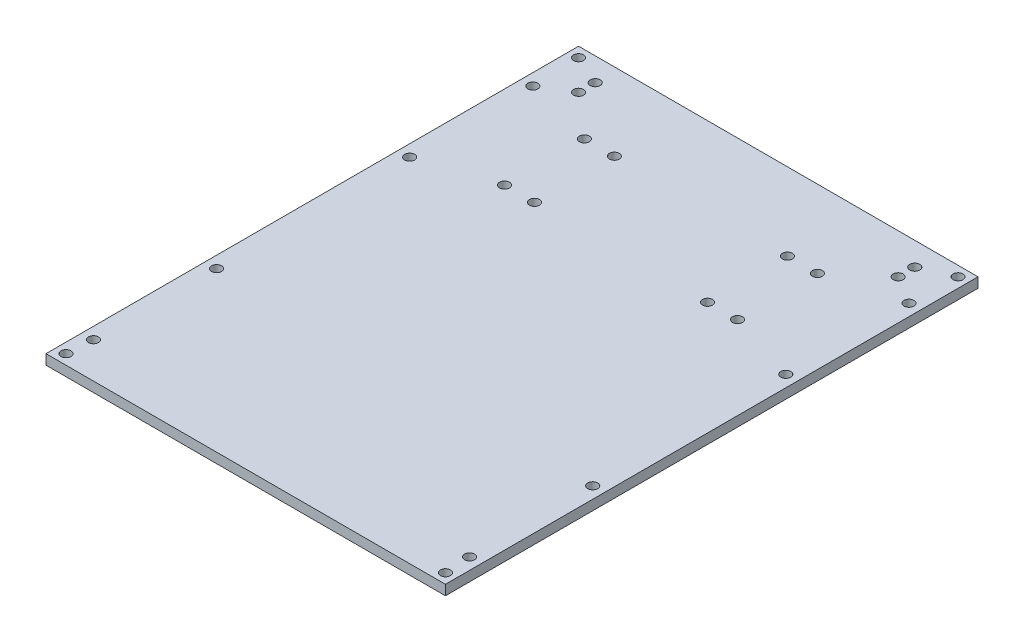
ISO-10303-21;
HEADER;
FILE_DESCRIPTION(('STEP AP214'),'2;1');
FILE_NAME('part.step','',(''),(''),'','','');
FILE_SCHEMA(('AUTOMOTIVE_DESIGN { 1 0 10303 214 1 1 1 1 }'));
ENDSEC;
DATA;
#1=APPLICATION_CONTEXT('core data for automotive mechanical design processes');
#2=APPLICATION_PROTOCOL_DEFINITION('international standard','automotive_design',2000,#1);
#3=PRODUCT_CONTEXT('',#1,'mechanical');
#4=PRODUCT('Part','Part','',(#3));
#5=PRODUCT_RELATED_PRODUCT_CATEGORY('part','',(#4));
#6=PRODUCT_DEFINITION_FORMATION('','',#4);
#7=PRODUCT_DEFINITION_CONTEXT('part definition',#1,'design');
#8=PRODUCT_DEFINITION('design','',#6,#7);
#9=PRODUCT_DEFINITION_SHAPE('','',#8);
#10=(LENGTH_UNIT() NAMED_UNIT(*) SI_UNIT(.MILLI.,.METRE.));
#11=(NAMED_UNIT(*) PLANE_ANGLE_UNIT() SI_UNIT($,.RADIAN.));
#12=(NAMED_UNIT(*) SI_UNIT($,.STERADIAN.) SOLID_ANGLE_UNIT());
#13=UNCERTAINTY_MEASURE_WITH_UNIT(LENGTH_MEASURE(1.E-05),#10,'distance_accuracy_value','');
#14=(GEOMETRIC_REPRESENTATION_CONTEXT(3) GLOBAL_UNCERTAINTY_ASSIGNED_CONTEXT((#13)) GLOBAL_UNIT_ASSIGNED_CONTEXT((#10,
#11,#12)) REPRESENTATION_CONTEXT('',''));
#15=CARTESIAN_POINT('',(0.,0.,0.));
#16=DIRECTION('',(0.,0.,1.));
#17=DIRECTION('',(1.,0.,0.));
#18=AXIS2_PLACEMENT_3D('',#15,#16,#17);
#19=CARTESIAN_POINT('',(0.,3.,0.));
#20=DIRECTION('',(0.,1.,0.));
#21=DIRECTION('',(0.,0.,1.));
#22=AXIS2_PLACEMENT_3D('',#19,#20,#21);
#23=PLANE('',#22);
#24=CARTESIAN_POINT('',(-3.,3.,-157.));
#25=DIRECTION('',(0.,1.,0.));
#26=DIRECTION('',(0.,0.,1.));
#27=AXIS2_PLACEMENT_3D('',#24,#25,#26);
#28=CIRCLE('',#27,1.5);
#29=CARTESIAN_POINT('',(-3.,3.,-155.5));
#30=VERTEX_POINT('',#29);
#31=EDGE_CURVE('E480',#30,#30,#28,.T.);
#32=ORIENTED_EDGE('',*,*,#31,.F.);
#33=EDGE_LOOP('',(#32));
#34=FACE_BOUND('',#33,.T.);
#35=CARTESIAN_POINT('',(-117.,3.,-3.));
#36=DIRECTION('',(0.,1.,0.));
#37=DIRECTION('',(0.,0.,1.));
#38=AXIS2_PLACEMENT_3D('',#35,#36,#37);
#39=CIRCLE('',#38,1.5);
#40=CARTESIAN_POINT('',(-117.,3.,-1.5));
#41=VERTEX_POINT('',#40);
#42=EDGE_CURVE('E481',#41,#41,#39,.T.);
#43=ORIENTED_EDGE('',*,*,#42,.F.);
#44=EDGE_LOOP('',(#43));
#45=FACE_BOUND('',#44,.T.);
#46=CARTESIAN_POINT('',(-3.,3.,-3.));
#47=DIRECTION('',(0.,1.,0.));
#48=DIRECTION('',(0.,0.,1.));
#49=AXIS2_PLACEMENT_3D('',#46,#47,#48);
#50=CIRCLE('',#49,1.5);
#51=CARTESIAN_POINT('',(-3.,3.,-1.5));
#52=VERTEX_POINT('',#51);
#53=EDGE_CURVE('E485',#52,#52,#50,.T.);
#54=ORIENTED_EDGE('',*,*,#53,.F.);
#55=EDGE_LOOP('',(#54));
#56=FACE_BOUND('',#55,.T.);
#57=CARTESIAN_POINT('',(-117.,3.,-157.));
#58=DIRECTION('',(0.,1.,0.));
#59=DIRECTION('',(0.,0.,1.));
#60=AXIS2_PLACEMENT_3D('',#57,#58,#59);
#61=CIRCLE('',#60,1.5);
#62=CARTESIAN_POINT('',(-117.,3.,-155.5));
#63=VERTEX_POINT('',#62);
#64=EDGE_CURVE('E114',#63,#63,#61,.T.);
#65=ORIENTED_EDGE('',*,*,#64,.F.);
#66=EDGE_LOOP('',(#65));
#67=FACE_BOUND('',#66,.T.);
#68=CARTESIAN_POINT('',(-3.5,3.,-47.75));
#69=DIRECTION('',(0.,1.,0.));
#70=DIRECTION('',(0.,0.,1.));
#71=AXIS2_PLACEMENT_3D('',#68,#69,#70);
#72=CIRCLE('',#71,1.5);
#73=CARTESIAN_POINT('',(-3.5,3.,-46.25));
#74=VERTEX_POINT('',#73);
#75=EDGE_CURVE('E189',#74,#74,#72,.T.);
#76=ORIENTED_EDGE('',*,*,#75,.F.);
#77=EDGE_LOOP('',(#76));
#78=FACE_BOUND('',#77,.T.);
#79=CARTESIAN_POINT('',(-95.,3.,-112.75));
#80=DIRECTION('',(0.,-1.,0.));
#81=DIRECTION('',(0.,0.,-1.));
#82=AXIS2_PLACEMENT_3D('',#79,#80,#81);
#83=CIRCLE('',#82,1.5);
#84=CARTESIAN_POINT('',(-95.,3.,-114.25));
#85=VERTEX_POINT('',#84);
#86=EDGE_CURVE('E177',#85,#85,#83,.T.);
#87=ORIENTED_EDGE('',*,*,#86,.T.);
#88=EDGE_LOOP('',(#87));
#89=FACE_BOUND('',#88,.T.);
#90=CARTESIAN_POINT('',(-86.,3.,-136.75));
#91=DIRECTION('',(0.,-1.,0.));
#92=DIRECTION('',(0.,0.,-1.));
#93=AXIS2_PLACEMENT_3D('',#90,#91,#92);
#94=CIRCLE('',#93,1.5);
#95=CARTESIAN_POINT('',(-86.,3.,-138.25));
#96=VERTEX_POINT('',#95);
#97=EDGE_CURVE('E165',#96,#96,#94,.T.);
#98=ORIENTED_EDGE('',*,*,#97,.T.);
#99=EDGE_LOOP('',(#98));
#100=FACE_BOUND('',#99,.T.);
#101=CARTESIAN_POINT('',(-116.5,3.,-142.75));
#102=DIRECTION('',(0.,-1.,0.));
#103=DIRECTION('',(0.,0.,-1.));
#104=AXIS2_PLACEMENT_3D('',#101,#102,#103);
#105=CIRCLE('',#104,1.50000000000002);
#106=CARTESIAN_POINT('',(-116.5,3.,-144.25));
#107=VERTEX_POINT('',#106);
#108=EDGE_CURVE('E153',#107,#107,#105,.T.);
#109=ORIENTED_EDGE('',*,*,#108,.T.);
#110=EDGE_LOOP('',(#109));
#111=FACE_BOUND('',#110,.T.);
#112=CARTESIAN_POINT('',(-108.,3.,-153.));
#113=DIRECTION('',(0.,-1.,0.));
#114=DIRECTION('',(0.,0.,-1.));
#115=AXIS2_PLACEMENT_3D('',#112,#113,#114);
#116=CIRCLE('',#115,1.50000000000002);
#117=CARTESIAN_POINT('',(-108.,3.,-154.5));
#118=VERTEX_POINT('',#117);
#119=EDGE_CURVE('E237',#118,#118,#116,.T.);
#120=ORIENTED_EDGE('',*,*,#119,.T.);
#121=EDGE_LOOP('',(#120));
#122=FACE_BOUND('',#121,.T.);
#123=CARTESIAN_POINT('',(-12.,3.,-153.));
#124=DIRECTION('',(0.,1.,0.));
#125=DIRECTION('',(0.,0.,1.));
#126=AXIS2_PLACEMENT_3D('',#123,#124,#125);
#127=CIRCLE('',#126,1.5);
#128=CARTESIAN_POINT('',(-12.,3.,-151.5));
#129=VERTEX_POINT('',#128);
#130=EDGE_CURVE('E231',#129,#129,#127,.T.);
#131=ORIENTED_EDGE('',*,*,#130,.F.);
#132=EDGE_LOOP('',(#131));
#133=FACE_BOUND('',#132,.T.);
#134=CARTESIAN_POINT('',(-12.,3.,-148.));
#135=DIRECTION('',(0.,1.,0.));
#136=DIRECTION('',(0.,0.,1.));
#137=AXIS2_PLACEMENT_3D('',#134,#135,#136);
#138=CIRCLE('',#137,1.5);
#139=CARTESIAN_POINT('',(-12.,3.,-146.5));
#140=VERTEX_POINT('',#139);
#141=EDGE_CURVE('E225',#140,#140,#138,.T.);
#142=ORIENTED_EDGE('',*,*,#141,.F.);
#143=EDGE_LOOP('',(#142));
#144=FACE_BOUND('',#143,.T.);
#145=CARTESIAN_POINT('',(-3.49999999999999,3.,-142.75));
#146=DIRECTION('',(0.,1.,0.));
#147=DIRECTION('',(0.,0.,1.));
#148=AXIS2_PLACEMENT_3D('',#145,#146,#147);
#149=CIRCLE('',#148,1.5);
#150=CARTESIAN_POINT('',(-3.49999999999999,3.,-141.25));
#151=VERTEX_POINT('',#150);
#152=EDGE_CURVE('E207',#151,#151,#149,.T.);
#153=ORIENTED_EDGE('',*,*,#152,.F.);
#154=EDGE_LOOP('',(#153));
#155=FACE_BOUND('',#154,.T.);
#156=CARTESIAN_POINT('',(-3.49999999999999,3.,-105.75));
#157=DIRECTION('',(0.,1.,0.));
#158=DIRECTION('',(0.,0.,1.));
#159=AXIS2_PLACEMENT_3D('',#156,#157,#158);
#160=CIRCLE('',#159,1.5);
#161=CARTESIAN_POINT('',(-3.49999999999999,3.,-104.25));
#162=VERTEX_POINT('',#161);
#163=EDGE_CURVE('E208',#162,#162,#160,.T.);
#164=ORIENTED_EDGE('',*,*,#163,.F.);
#165=EDGE_LOOP('',(#164));
#166=FACE_BOUND('',#165,.T.);
#167=CARTESIAN_POINT('',(-34.,3.,-136.75));
#168=DIRECTION('',(0.,1.,0.));
#169=DIRECTION('',(0.,0.,1.));
#170=AXIS2_PLACEMENT_3D('',#167,#168,#169);
#171=CIRCLE('',#170,1.5);
#172=CARTESIAN_POINT('',(-34.,3.,-135.25));
#173=VERTEX_POINT('',#172);
#174=EDGE_CURVE('E215',#173,#173,#171,.T.);
#175=ORIENTED_EDGE('',*,*,#174,.F.);
#176=EDGE_LOOP('',(#175));
#177=FACE_BOUND('',#176,.T.);
#178=CARTESIAN_POINT('',(-25.,3.,-136.75));
#179=DIRECTION('',(0.,1.,0.));
#180=DIRECTION('',(0.,0.,1.));
#181=AXIS2_PLACEMENT_3D('',#178,#179,#180);
#182=CIRCLE('',#181,1.5);
#183=CARTESIAN_POINT('',(-25.,3.,-135.25));
#184=VERTEX_POINT('',#183);
#185=EDGE_CURVE('E194',#184,#184,#182,.T.);
#186=ORIENTED_EDGE('',*,*,#185,.F.);
#187=EDGE_LOOP('',(#186));
#188=FACE_BOUND('',#187,.T.);
#189=CARTESIAN_POINT('',(-34.,3.,-112.75));
#190=DIRECTION('',(0.,1.,0.));
#191=DIRECTION('',(0.,0.,1.));
#192=AXIS2_PLACEMENT_3D('',#189,#190,#191);
#193=CIRCLE('',#192,1.5);
#194=CARTESIAN_POINT('',(-34.,3.,-111.25));
#195=VERTEX_POINT('',#194);
#196=EDGE_CURVE('E201',#195,#195,#193,.T.);
#197=ORIENTED_EDGE('',*,*,#196,.F.);
#198=EDGE_LOOP('',(#197));
#199=FACE_BOUND('',#198,.T.);
#200=CARTESIAN_POINT('',(-116.5,3.,-47.75));
#201=DIRECTION('',(0.,-1.,0.));
#202=DIRECTION('',(0.,0.,-1.));
#203=AXIS2_PLACEMENT_3D('',#200,#201,#202);
#204=CIRCLE('',#203,1.5);
#205=CARTESIAN_POINT('',(-116.5,3.,-49.25));
#206=VERTEX_POINT('',#205);
#207=EDGE_CURVE('E141',#206,#206,#204,.T.);
#208=ORIENTED_EDGE('',*,*,#207,.T.);
#209=EDGE_LOOP('',(#208));
#210=FACE_BOUND('',#209,.T.);
#211=CARTESIAN_POINT('',(-3.5,3.,-10.75));
#212=DIRECTION('',(0.,1.,0.));
#213=DIRECTION('',(0.,0.,1.));
#214=AXIS2_PLACEMENT_3D('',#211,#212,#213);
#215=CIRCLE('',#214,1.5);
#216=CARTESIAN_POINT('',(-3.5,3.,-9.25000000000001));
#217=VERTEX_POINT('',#216);
#218=EDGE_CURVE('E134',#217,#217,#215,.T.);
#219=ORIENTED_EDGE('',*,*,#218,.F.);
#220=EDGE_LOOP('',(#219));
#221=FACE_BOUND('',#220,.T.);
#222=CARTESIAN_POINT('',(-25.,3.,-112.75));
#223=DIRECTION('',(0.,1.,0.));
#224=DIRECTION('',(0.,0.,1.));
#225=AXIS2_PLACEMENT_3D('',#222,#223,#224);
#226=CIRCLE('',#225,1.5);
#227=CARTESIAN_POINT('',(-25.,3.,-111.25));
#228=VERTEX_POINT('',#227);
#229=EDGE_CURVE('E211',#228,#228,#226,.T.);
#230=ORIENTED_EDGE('',*,*,#229,.F.);
#231=EDGE_LOOP('',(#230));
#232=FACE_BOUND('',#231,.T.);
#233=DIRECTION('',(0.,0.,1.));
#234=VECTOR('',#233,1.);
#235=CARTESIAN_POINT('',(-120.,3.,-160.));
#236=LINE('',#235,#234);
#237=CARTESIAN_POINT('',(-120.,3.,-160.));
#238=VERTEX_POINT('',#237);
#239=CARTESIAN_POINT('',(-120.,3.,0.));
#240=VERTEX_POINT('',#239);
#241=EDGE_CURVE('E88',#238,#240,#236,.T.);
#242=ORIENTED_EDGE('',*,*,#241,.T.);
#243=DIRECTION('',(1.,0.,0.));
#244=VECTOR('',#243,1.);
#245=CARTESIAN_POINT('',(-120.,3.,0.));
#246=LINE('',#245,#244);
#247=CARTESIAN_POINT('',(0.,3.,0.));
#248=VERTEX_POINT('',#247);
#249=EDGE_CURVE('E83',#240,#248,#246,.T.);
#250=ORIENTED_EDGE('',*,*,#249,.T.);
#251=DIRECTION('',(0.,0.,-1.));
#252=VECTOR('',#251,1.);
#253=CARTESIAN_POINT('',(0.,3.,-160.));
#254=LINE('',#253,#252);
#255=CARTESIAN_POINT('',(0.,3.,-160.));
#256=VERTEX_POINT('',#255);
#257=EDGE_CURVE('E86',#248,#256,#254,.T.);
#258=ORIENTED_EDGE('',*,*,#257,.T.);
#259=DIRECTION('',(-1.,0.,0.));
#260=VECTOR('',#259,1.);
#261=CARTESIAN_POINT('',(-120.,3.,-160.));
#262=LINE('',#261,#260);
#263=EDGE_CURVE('E53',#256,#238,#262,.T.);
#264=ORIENTED_EDGE('',*,*,#263,.T.);
#265=EDGE_LOOP('',(#242,#250,#258,#264));
#266=FACE_BOUND('',#265,.T.);
#267=CARTESIAN_POINT('',(-116.5,3.,-10.75));
#268=DIRECTION('',(0.,-1.,0.));
#269=DIRECTION('',(0.,0.,-1.));
#270=AXIS2_PLACEMENT_3D('',#267,#268,#269);
#271=CIRCLE('',#270,1.5);
#272=CARTESIAN_POINT('',(-116.5,3.,-12.25));
#273=VERTEX_POINT('',#272);
#274=EDGE_CURVE('E125',#273,#273,#271,.T.);
#275=ORIENTED_EDGE('',*,*,#274,.T.);
#276=EDGE_LOOP('',(#275));
#277=FACE_BOUND('',#276,.T.);
#278=CARTESIAN_POINT('',(-108.,3.,-148.));
#279=DIRECTION('',(0.,-1.,0.));
#280=DIRECTION('',(0.,0.,-1.));
#281=AXIS2_PLACEMENT_3D('',#278,#279,#280);
#282=CIRCLE('',#281,1.5);
#283=CARTESIAN_POINT('',(-108.,3.,-149.5));
#284=VERTEX_POINT('',#283);
#285=EDGE_CURVE('E146',#284,#284,#282,.T.);
#286=ORIENTED_EDGE('',*,*,#285,.T.);
#287=EDGE_LOOP('',(#286));
#288=FACE_BOUND('',#287,.T.);
#289=CARTESIAN_POINT('',(-95.,3.,-136.75));
#290=DIRECTION('',(0.,-1.,0.));
#291=DIRECTION('',(0.,0.,-1.));
#292=AXIS2_PLACEMENT_3D('',#289,#290,#291);
#293=CIRCLE('',#292,1.5);
#294=CARTESIAN_POINT('',(-95.,3.,-138.25));
#295=VERTEX_POINT('',#294);
#296=EDGE_CURVE('E159',#295,#295,#293,.T.);
#297=ORIENTED_EDGE('',*,*,#296,.T.);
#298=EDGE_LOOP('',(#297));
#299=FACE_BOUND('',#298,.T.);
#300=CARTESIAN_POINT('',(-86.,3.,-112.75));
#301=DIRECTION('',(0.,-1.,0.));
#302=DIRECTION('',(0.,0.,-1.));
#303=AXIS2_PLACEMENT_3D('',#300,#301,#302);
#304=CIRCLE('',#303,1.5);
#305=CARTESIAN_POINT('',(-86.,3.,-114.25));
#306=VERTEX_POINT('',#305);
#307=EDGE_CURVE('E171',#306,#306,#304,.T.);
#308=ORIENTED_EDGE('',*,*,#307,.T.);
#309=EDGE_LOOP('',(#308));
#310=FACE_BOUND('',#309,.T.);
#311=CARTESIAN_POINT('',(-116.5,3.,-105.75));
#312=DIRECTION('',(0.,-1.,0.));
#313=DIRECTION('',(0.,0.,-1.));
#314=AXIS2_PLACEMENT_3D('',#311,#312,#313);
#315=CIRCLE('',#314,1.50000000000002);
#316=CARTESIAN_POINT('',(-116.5,3.,-107.25));
#317=VERTEX_POINT('',#316);
#318=EDGE_CURVE('E183',#317,#317,#315,.T.);
#319=ORIENTED_EDGE('',*,*,#318,.T.);
#320=EDGE_LOOP('',(#319));
#321=FACE_BOUND('',#320,.T.);
#322=ADVANCED_FACE('F34',(#34,#45,#56,#67,#78,#89,#100,#111,#122,#133,#144,#155,#166,#177,#188,
#199,#210,#221,#232,#266,#277,#288,#299,#310,#321),#23,.T.);
#323=CARTESIAN_POINT('',(0.,0.,0.));
#324=DIRECTION('',(0.,1.,0.));
#325=DIRECTION('',(0.,0.,1.));
#326=AXIS2_PLACEMENT_3D('',#323,#324,#325);
#327=PLANE('',#326);
#328=CARTESIAN_POINT('',(-3.,0.,-157.));
#329=DIRECTION('',(0.,1.,0.));
#330=DIRECTION('',(0.,0.,1.));
#331=AXIS2_PLACEMENT_3D('',#328,#329,#330);
#332=CIRCLE('',#331,1.5);
#333=CARTESIAN_POINT('',(-3.,0.,-155.5));
#334=VERTEX_POINT('',#333);
#335=EDGE_CURVE('E38',#334,#334,#332,.T.);
#336=ORIENTED_EDGE('',*,*,#335,.T.);
#337=EDGE_LOOP('',(#336));
#338=FACE_BOUND('',#337,.T.);
#339=CARTESIAN_POINT('',(-117.,0.,-3.));
#340=DIRECTION('',(0.,1.,0.));
#341=DIRECTION('',(0.,0.,1.));
#342=AXIS2_PLACEMENT_3D('',#339,#340,#341);
#343=CIRCLE('',#342,1.5);
#344=CARTESIAN_POINT('',(-117.,0.,-1.5));
#345=VERTEX_POINT('',#344);
#346=EDGE_CURVE('E116',#345,#345,#343,.T.);
#347=ORIENTED_EDGE('',*,*,#346,.T.);
#348=EDGE_LOOP('',(#347));
#349=FACE_BOUND('',#348,.T.);
#350=CARTESIAN_POINT('',(-3.,0.,-3.));
#351=DIRECTION('',(0.,1.,0.));
#352=DIRECTION('',(0.,0.,1.));
#353=AXIS2_PLACEMENT_3D('',#350,#351,#352);
#354=CIRCLE('',#353,1.5);
#355=CARTESIAN_POINT('',(-3.,0.,-1.5));
#356=VERTEX_POINT('',#355);
#357=EDGE_CURVE('E113',#356,#356,#354,.T.);
#358=ORIENTED_EDGE('',*,*,#357,.T.);
#359=EDGE_LOOP('',(#358));
#360=FACE_BOUND('',#359,.T.);
#361=CARTESIAN_POINT('',(-117.,0.,-157.));
#362=DIRECTION('',(0.,1.,0.));
#363=DIRECTION('',(0.,0.,1.));
#364=AXIS2_PLACEMENT_3D('',#361,#362,#363);
#365=CIRCLE('',#364,1.5);
#366=CARTESIAN_POINT('',(-117.,0.,-155.5));
#367=VERTEX_POINT('',#366);
#368=EDGE_CURVE('E110',#367,#367,#365,.T.);
#369=ORIENTED_EDGE('',*,*,#368,.T.);
#370=EDGE_LOOP('',(#369));
#371=FACE_BOUND('',#370,.T.);
#372=CARTESIAN_POINT('',(-3.5,0.,-47.75));
#373=DIRECTION('',(0.,1.,0.));
#374=DIRECTION('',(0.,0.,1.));
#375=AXIS2_PLACEMENT_3D('',#372,#373,#374);
#376=CIRCLE('',#375,1.5);
#377=CARTESIAN_POINT('',(-3.5,0.,-46.25));
#378=VERTEX_POINT('',#377);
#379=EDGE_CURVE('E137',#378,#378,#376,.T.);
#380=ORIENTED_EDGE('',*,*,#379,.T.);
#381=EDGE_LOOP('',(#380));
#382=FACE_BOUND('',#381,.T.);
#383=CARTESIAN_POINT('',(-12.,0.,-153.));
#384=DIRECTION('',(0.,1.,0.));
#385=DIRECTION('',(0.,0.,1.));
#386=AXIS2_PLACEMENT_3D('',#383,#384,#385);
#387=CIRCLE('',#386,1.5);
#388=CARTESIAN_POINT('',(-12.,0.,-151.5));
#389=VERTEX_POINT('',#388);
#390=EDGE_CURVE('E234',#389,#389,#387,.T.);
#391=ORIENTED_EDGE('',*,*,#390,.T.);
#392=EDGE_LOOP('',(#391));
#393=FACE_BOUND('',#392,.T.);
#394=CARTESIAN_POINT('',(-12.,0.,-148.));
#395=DIRECTION('',(0.,1.,0.));
#396=DIRECTION('',(0.,0.,1.));
#397=AXIS2_PLACEMENT_3D('',#394,#395,#396);
#398=CIRCLE('',#397,1.5);
#399=CARTESIAN_POINT('',(-12.,0.,-146.5));
#400=VERTEX_POINT('',#399);
#401=EDGE_CURVE('E228',#400,#400,#398,.T.);
#402=ORIENTED_EDGE('',*,*,#401,.T.);
#403=EDGE_LOOP('',(#402));
#404=FACE_BOUND('',#403,.T.);
#405=CARTESIAN_POINT('',(-3.49999999999999,0.,-142.75));
#406=DIRECTION('',(0.,1.,0.));
#407=DIRECTION('',(0.,0.,1.));
#408=AXIS2_PLACEMENT_3D('',#405,#406,#407);
#409=CIRCLE('',#408,1.5);
#410=CARTESIAN_POINT('',(-3.49999999999999,0.,-141.25));
#411=VERTEX_POINT('',#410);
#412=EDGE_CURVE('E222',#411,#411,#409,.T.);
#413=ORIENTED_EDGE('',*,*,#412,.T.);
#414=EDGE_LOOP('',(#413));
#415=FACE_BOUND('',#414,.T.);
#416=CARTESIAN_POINT('',(-3.49999999999999,0.,-105.75));
#417=DIRECTION('',(0.,1.,0.));
#418=DIRECTION('',(0.,0.,1.));
#419=AXIS2_PLACEMENT_3D('',#416,#417,#418);
#420=CIRCLE('',#419,1.5);
#421=CARTESIAN_POINT('',(-3.49999999999999,0.,-104.25));
#422=VERTEX_POINT('',#421);
#423=EDGE_CURVE('E212',#422,#422,#420,.T.);
#424=ORIENTED_EDGE('',*,*,#423,.T.);
#425=EDGE_LOOP('',(#424));
#426=FACE_BOUND('',#425,.T.);
#427=CARTESIAN_POINT('',(-34.,0.,-136.75));
#428=DIRECTION('',(0.,1.,0.));
#429=DIRECTION('',(0.,0.,1.));
#430=AXIS2_PLACEMENT_3D('',#427,#428,#429);
#431=CIRCLE('',#430,1.5);
#432=CARTESIAN_POINT('',(-34.,0.,-135.25));
#433=VERTEX_POINT('',#432);
#434=EDGE_CURVE('E197',#433,#433,#431,.T.);
#435=ORIENTED_EDGE('',*,*,#434,.T.);
#436=EDGE_LOOP('',(#435));
#437=FACE_BOUND('',#436,.T.);
#438=CARTESIAN_POINT('',(-25.,0.,-136.75));
#439=DIRECTION('',(0.,1.,0.));
#440=DIRECTION('',(0.,0.,1.));
#441=AXIS2_PLACEMENT_3D('',#438,#439,#440);
#442=CIRCLE('',#441,1.5);
#443=CARTESIAN_POINT('',(-25.,0.,-135.25));
#444=VERTEX_POINT('',#443);
#445=EDGE_CURVE('E198',#444,#444,#442,.T.);
#446=ORIENTED_EDGE('',*,*,#445,.T.);
#447=EDGE_LOOP('',(#446));
#448=FACE_BOUND('',#447,.T.);
#449=CARTESIAN_POINT('',(-34.,0.,-112.75));
#450=DIRECTION('',(0.,1.,0.));
#451=DIRECTION('',(0.,0.,1.));
#452=AXIS2_PLACEMENT_3D('',#449,#450,#451);
#453=CIRCLE('',#452,1.5);
#454=CARTESIAN_POINT('',(-34.,0.,-111.25));
#455=VERTEX_POINT('',#454);
#456=EDGE_CURVE('E204',#455,#455,#453,.T.);
#457=ORIENTED_EDGE('',*,*,#456,.T.);
#458=EDGE_LOOP('',(#457));
#459=FACE_BOUND('',#458,.T.);
#460=CARTESIAN_POINT('',(-3.5,0.,-10.75));
#461=DIRECTION('',(0.,1.,0.));
#462=DIRECTION('',(0.,0.,1.));
#463=AXIS2_PLACEMENT_3D('',#460,#461,#462);
#464=CIRCLE('',#463,1.5);
#465=CARTESIAN_POINT('',(-3.5,0.,-9.25000000000001));
#466=VERTEX_POINT('',#465);
#467=EDGE_CURVE('E138',#466,#466,#464,.T.);
#468=ORIENTED_EDGE('',*,*,#467,.T.);
#469=EDGE_LOOP('',(#468));
#470=FACE_BOUND('',#469,.T.);
#471=CARTESIAN_POINT('',(-25.,0.,-112.75));
#472=DIRECTION('',(0.,1.,0.));
#473=DIRECTION('',(0.,0.,1.));
#474=AXIS2_PLACEMENT_3D('',#471,#472,#473);
#475=CIRCLE('',#474,1.5);
#476=CARTESIAN_POINT('',(-25.,0.,-111.25));
#477=VERTEX_POINT('',#476);
#478=EDGE_CURVE('E104',#477,#477,#475,.T.);
#479=ORIENTED_EDGE('',*,*,#478,.T.);
#480=EDGE_LOOP('',(#479));
#481=FACE_BOUND('',#480,.T.);
#482=DIRECTION('',(0.,0.,1.));
#483=VECTOR('',#482,1.);
#484=CARTESIAN_POINT('',(-120.,0.,-160.));
#485=LINE('',#484,#483);
#486=CARTESIAN_POINT('',(-120.,0.,-160.));
#487=VERTEX_POINT('',#486);
#488=CARTESIAN_POINT('',(-120.,0.,0.));
#489=VERTEX_POINT('',#488);
#490=EDGE_CURVE('E101',#487,#489,#485,.T.);
#491=ORIENTED_EDGE('',*,*,#490,.F.);
#492=DIRECTION('',(-1.,0.,0.));
#493=VECTOR('',#492,1.);
#494=CARTESIAN_POINT('',(-120.,0.,-160.));
#495=LINE('',#494,#493);
#496=CARTESIAN_POINT('',(0.,0.,-160.));
#497=VERTEX_POINT('',#496);
#498=EDGE_CURVE('E76',#497,#487,#495,.T.);
#499=ORIENTED_EDGE('',*,*,#498,.F.);
#500=DIRECTION('',(0.,0.,-1.));
#501=VECTOR('',#500,1.);
#502=CARTESIAN_POINT('',(0.,0.,-160.));
#503=LINE('',#502,#501);
#504=CARTESIAN_POINT('',(0.,0.,0.));
#505=VERTEX_POINT('',#504);
#506=EDGE_CURVE('E70',#505,#497,#503,.T.);
#507=ORIENTED_EDGE('',*,*,#506,.F.);
#508=DIRECTION('',(1.,0.,0.));
#509=VECTOR('',#508,1.);
#510=CARTESIAN_POINT('',(-120.,0.,0.));
#511=LINE('',#510,#509);
#512=EDGE_CURVE('E92',#489,#505,#511,.T.);
#513=ORIENTED_EDGE('',*,*,#512,.F.);
#514=EDGE_LOOP('',(#491,#499,#507,#513));
#515=FACE_BOUND('',#514,.T.);
#516=CARTESIAN_POINT('',(-116.5,0.,-47.75));
#517=DIRECTION('',(0.,-1.,0.));
#518=DIRECTION('',(0.,0.,-1.));
#519=AXIS2_PLACEMENT_3D('',#516,#517,#518);
#520=CIRCLE('',#519,1.5);
#521=CARTESIAN_POINT('',(-116.5,0.,-49.25));
#522=VERTEX_POINT('',#521);
#523=EDGE_CURVE('E130',#522,#522,#520,.T.);
#524=ORIENTED_EDGE('',*,*,#523,.F.);
#525=EDGE_LOOP('',(#524));
#526=FACE_BOUND('',#525,.T.);
#527=CARTESIAN_POINT('',(-116.5,0.,-10.75));
#528=DIRECTION('',(0.,-1.,0.));
#529=DIRECTION('',(0.,0.,-1.));
#530=AXIS2_PLACEMENT_3D('',#527,#528,#529);
#531=CIRCLE('',#530,1.5);
#532=CARTESIAN_POINT('',(-116.5,0.,-12.25));
#533=VERTEX_POINT('',#532);
#534=EDGE_CURVE('E121',#533,#533,#531,.T.);
#535=ORIENTED_EDGE('',*,*,#534,.F.);
#536=EDGE_LOOP('',(#535));
#537=FACE_BOUND('',#536,.T.);
#538=CARTESIAN_POINT('',(-108.,0.,-153.));
#539=DIRECTION('',(0.,-1.,0.));
#540=DIRECTION('',(0.,0.,-1.));
#541=AXIS2_PLACEMENT_3D('',#538,#539,#540);
#542=CIRCLE('',#541,1.50000000000002);
#543=CARTESIAN_POINT('',(-108.,0.,-154.5));
#544=VERTEX_POINT('',#543);
#545=EDGE_CURVE('E149',#544,#544,#542,.T.);
#546=ORIENTED_EDGE('',*,*,#545,.F.);
#547=EDGE_LOOP('',(#546));
#548=FACE_BOUND('',#547,.T.);
#549=CARTESIAN_POINT('',(-108.,0.,-148.));
#550=DIRECTION('',(0.,-1.,0.));
#551=DIRECTION('',(0.,0.,-1.));
#552=AXIS2_PLACEMENT_3D('',#549,#550,#551);
#553=CIRCLE('',#552,1.5);
#554=CARTESIAN_POINT('',(-108.,0.,-149.5));
#555=VERTEX_POINT('',#554);
#556=EDGE_CURVE('E150',#555,#555,#553,.T.);
#557=ORIENTED_EDGE('',*,*,#556,.F.);
#558=EDGE_LOOP('',(#557));
#559=FACE_BOUND('',#558,.T.);
#560=CARTESIAN_POINT('',(-116.5,0.,-142.75));
#561=DIRECTION('',(0.,-1.,0.));
#562=DIRECTION('',(0.,0.,-1.));
#563=AXIS2_PLACEMENT_3D('',#560,#561,#562);
#564=CIRCLE('',#563,1.50000000000002);
#565=CARTESIAN_POINT('',(-116.5,0.,-144.25));
#566=VERTEX_POINT('',#565);
#567=EDGE_CURVE('E156',#566,#566,#564,.T.);
#568=ORIENTED_EDGE('',*,*,#567,.F.);
#569=EDGE_LOOP('',(#568));
#570=FACE_BOUND('',#569,.T.);
#571=CARTESIAN_POINT('',(-95.,0.,-136.75));
#572=DIRECTION('',(0.,-1.,0.));
#573=DIRECTION('',(0.,0.,-1.));
#574=AXIS2_PLACEMENT_3D('',#571,#572,#573);
#575=CIRCLE('',#574,1.5);
#576=CARTESIAN_POINT('',(-95.,0.,-138.25));
#577=VERTEX_POINT('',#576);
#578=EDGE_CURVE('E162',#577,#577,#575,.T.);
#579=ORIENTED_EDGE('',*,*,#578,.F.);
#580=EDGE_LOOP('',(#579));
#581=FACE_BOUND('',#580,.T.);
#582=CARTESIAN_POINT('',(-86.,0.,-136.75));
#583=DIRECTION('',(0.,-1.,0.));
#584=DIRECTION('',(0.,0.,-1.));
#585=AXIS2_PLACEMENT_3D('',#582,#583,#584);
#586=CIRCLE('',#585,1.5);
#587=CARTESIAN_POINT('',(-86.,0.,-138.25));
#588=VERTEX_POINT('',#587);
#589=EDGE_CURVE('E168',#588,#588,#586,.T.);
#590=ORIENTED_EDGE('',*,*,#589,.F.);
#591=EDGE_LOOP('',(#590));
#592=FACE_BOUND('',#591,.T.);
#593=CARTESIAN_POINT('',(-86.,0.,-112.75));
#594=DIRECTION('',(0.,-1.,0.));
#595=DIRECTION('',(0.,0.,-1.));
#596=AXIS2_PLACEMENT_3D('',#593,#594,#595);
#597=CIRCLE('',#596,1.5);
#598=CARTESIAN_POINT('',(-86.,0.,-114.25));
#599=VERTEX_POINT('',#598);
#600=EDGE_CURVE('E174',#599,#599,#597,.T.);
#601=ORIENTED_EDGE('',*,*,#600,.F.);
#602=EDGE_LOOP('',(#601));
#603=FACE_BOUND('',#602,.T.);
#604=CARTESIAN_POINT('',(-95.,0.,-112.75));
#605=DIRECTION('',(0.,-1.,0.));
#606=DIRECTION('',(0.,0.,-1.));
#607=AXIS2_PLACEMENT_3D('',#604,#605,#606);
#608=CIRCLE('',#607,1.5);
#609=CARTESIAN_POINT('',(-95.,0.,-114.25));
#610=VERTEX_POINT('',#609);
#611=EDGE_CURVE('E180',#610,#610,#608,.T.);
#612=ORIENTED_EDGE('',*,*,#611,.F.);
#613=EDGE_LOOP('',(#612));
#614=FACE_BOUND('',#613,.T.);
#615=CARTESIAN_POINT('',(-116.5,0.,-105.75));
#616=DIRECTION('',(0.,-1.,0.));
#617=DIRECTION('',(0.,0.,-1.));
#618=AXIS2_PLACEMENT_3D('',#615,#616,#617);
#619=CIRCLE('',#618,1.50000000000002);
#620=CARTESIAN_POINT('',(-116.5,0.,-107.25));
#621=VERTEX_POINT('',#620);
#622=EDGE_CURVE('E186',#621,#621,#619,.T.);
#623=ORIENTED_EDGE('',*,*,#622,.F.);
#624=EDGE_LOOP('',(#623));
#625=FACE_BOUND('',#624,.T.);
#626=ADVANCED_FACE('F250',(#338,#349,#360,#371,#382,#393,#404,#415,#426,#437,#448,#459,#470,
#481,#515,#526,#537,#548,#559,#570,#581,#592,#603,#614,#625),#327,.F.);
#627=CARTESIAN_POINT('',(-120.,3.,-160.));
#628=DIRECTION('',(1.,0.,0.));
#629=DIRECTION('',(0.,0.,-1.));
#630=AXIS2_PLACEMENT_3D('',#627,#628,#629);
#631=PLANE('',#630);
#632=ORIENTED_EDGE('',*,*,#490,.T.);
#633=DIRECTION('',(0.,-1.,0.));
#634=VECTOR('',#633,1.);
#635=CARTESIAN_POINT('',(-120.,3.,0.));
#636=LINE('',#635,#634);
#637=EDGE_CURVE('E11',#240,#489,#636,.T.);
#638=ORIENTED_EDGE('',*,*,#637,.F.);
#639=ORIENTED_EDGE('',*,*,#241,.F.);
#640=DIRECTION('',(0.,-1.,0.));
#641=VECTOR('',#640,1.);
#642=CARTESIAN_POINT('',(-120.,3.,-160.));
#643=LINE('',#642,#641);
#644=EDGE_CURVE('E97',#238,#487,#643,.T.);
#645=ORIENTED_EDGE('',*,*,#644,.T.);
#646=EDGE_LOOP('',(#632,#638,#639,#645));
#647=FACE_BOUND('',#646,.T.);
#648=ADVANCED_FACE('F36',(#647),#631,.F.);
#649=CARTESIAN_POINT('',(-120.,3.,0.));
#650=DIRECTION('',(0.,0.,-1.));
#651=DIRECTION('',(-1.,0.,0.));
#652=AXIS2_PLACEMENT_3D('',#649,#650,#651);
#653=PLANE('',#652);
#654=ORIENTED_EDGE('',*,*,#512,.T.);
#655=DIRECTION('',(0.,-1.,0.));
#656=VECTOR('',#655,1.);
#657=CARTESIAN_POINT('',(0.,3.,0.));
#658=LINE('',#657,#656);
#659=EDGE_CURVE('E44',#248,#505,#658,.T.);
#660=ORIENTED_EDGE('',*,*,#659,.F.);
#661=ORIENTED_EDGE('',*,*,#249,.F.);
#662=ORIENTED_EDGE('',*,*,#637,.T.);
#663=EDGE_LOOP('',(#654,#660,#661,#662));
#664=FACE_BOUND('',#663,.T.);
#665=ADVANCED_FACE('F91',(#664),#653,.F.);
#666=CARTESIAN_POINT('',(0.,3.,-160.));
#667=DIRECTION('',(-1.,0.,0.));
#668=DIRECTION('',(0.,0.,1.));
#669=AXIS2_PLACEMENT_3D('',#666,#667,#668);
#670=PLANE('',#669);
#671=ORIENTED_EDGE('',*,*,#506,.T.);
#672=DIRECTION('',(0.,-1.,0.));
#673=VECTOR('',#672,1.);
#674=CARTESIAN_POINT('',(0.,3.,-160.));
#675=LINE('',#674,#673);
#676=EDGE_CURVE('E93',#256,#497,#675,.T.);
#677=ORIENTED_EDGE('',*,*,#676,.F.);
#678=ORIENTED_EDGE('',*,*,#257,.F.);
#679=ORIENTED_EDGE('',*,*,#659,.T.);
#680=EDGE_LOOP('',(#671,#677,#678,#679));
#681=FACE_BOUND('',#680,.T.);
#682=ADVANCED_FACE('F95',(#681),#670,.F.);
#683=CARTESIAN_POINT('',(-120.,3.,-160.));
#684=DIRECTION('',(0.,0.,1.));
#685=DIRECTION('',(1.,0.,0.));
#686=AXIS2_PLACEMENT_3D('',#683,#684,#685);
#687=PLANE('',#686);
#688=ORIENTED_EDGE('',*,*,#498,.T.);
#689=ORIENTED_EDGE('',*,*,#644,.F.);
#690=ORIENTED_EDGE('',*,*,#263,.F.);
#691=ORIENTED_EDGE('',*,*,#676,.T.);
#692=EDGE_LOOP('',(#688,#689,#690,#691));
#693=FACE_BOUND('',#692,.T.);
#694=ADVANCED_FACE('F262',(#693),#687,.F.);
#695=CARTESIAN_POINT('',(-25.,0.,-112.75));
#696=DIRECTION('',(0.,1.,0.));
#697=DIRECTION('',(0.,0.,1.));
#698=AXIS2_PLACEMENT_3D('',#695,#696,#697);
#699=CYLINDRICAL_SURFACE('',#698,1.5);
#700=ORIENTED_EDGE('',*,*,#478,.F.);
#701=EDGE_LOOP('',(#700));
#702=FACE_BOUND('',#701,.T.);
#703=ORIENTED_EDGE('',*,*,#229,.T.);
#704=EDGE_LOOP('',(#703));
#705=FACE_BOUND('',#704,.T.);
#706=ADVANCED_FACE('F247',(#702,#705),#699,.F.);
#707=CARTESIAN_POINT('',(-3.5,0.,-10.75));
#708=DIRECTION('',(0.,1.,0.));
#709=DIRECTION('',(0.,0.,1.));
#710=AXIS2_PLACEMENT_3D('',#707,#708,#709);
#711=CYLINDRICAL_SURFACE('',#710,1.5);
#712=ORIENTED_EDGE('',*,*,#467,.F.);
#713=EDGE_LOOP('',(#712));
#714=FACE_BOUND('',#713,.T.);
#715=ORIENTED_EDGE('',*,*,#218,.T.);
#716=EDGE_LOOP('',(#715));
#717=FACE_BOUND('',#716,.T.);
#718=ADVANCED_FACE('F375',(#714,#717),#711,.F.);
#719=CARTESIAN_POINT('',(-116.5,0.,-47.75));
#720=DIRECTION('',(0.,1.,0.));
#721=DIRECTION('',(0.,0.,1.));
#722=AXIS2_PLACEMENT_3D('',#719,#720,#721);
#723=CYLINDRICAL_SURFACE('',#722,1.5);
#724=ORIENTED_EDGE('',*,*,#523,.T.);
#725=EDGE_LOOP('',(#724));
#726=FACE_BOUND('',#725,.T.);
#727=ORIENTED_EDGE('',*,*,#207,.F.);
#728=EDGE_LOOP('',(#727));
#729=FACE_BOUND('',#728,.T.);
#730=ADVANCED_FACE('F377',(#726,#729),#723,.F.);
#731=CARTESIAN_POINT('',(-116.5,0.,-10.75));
#732=DIRECTION('',(0.,1.,0.));
#733=DIRECTION('',(0.,0.,1.));
#734=AXIS2_PLACEMENT_3D('',#731,#732,#733);
#735=CYLINDRICAL_SURFACE('',#734,1.5);
#736=ORIENTED_EDGE('',*,*,#534,.T.);
#737=EDGE_LOOP('',(#736));
#738=FACE_BOUND('',#737,.T.);
#739=ORIENTED_EDGE('',*,*,#274,.F.);
#740=EDGE_LOOP('',(#739));
#741=FACE_BOUND('',#740,.T.);
#742=ADVANCED_FACE('F323',(#738,#741),#735,.F.);
#743=CARTESIAN_POINT('',(-34.,0.,-112.75));
#744=DIRECTION('',(0.,1.,0.));
#745=DIRECTION('',(0.,0.,1.));
#746=AXIS2_PLACEMENT_3D('',#743,#744,#745);
#747=CYLINDRICAL_SURFACE('',#746,1.5);
#748=ORIENTED_EDGE('',*,*,#456,.F.);
#749=EDGE_LOOP('',(#748));
#750=FACE_BOUND('',#749,.T.);
#751=ORIENTED_EDGE('',*,*,#196,.T.);
#752=EDGE_LOOP('',(#751));
#753=FACE_BOUND('',#752,.T.);
#754=ADVANCED_FACE('F319',(#750,#753),#747,.F.);
#755=CARTESIAN_POINT('',(-25.,0.,-136.75));
#756=DIRECTION('',(0.,1.,0.));
#757=DIRECTION('',(0.,0.,1.));
#758=AXIS2_PLACEMENT_3D('',#755,#756,#757);
#759=CYLINDRICAL_SURFACE('',#758,1.5);
#760=ORIENTED_EDGE('',*,*,#445,.F.);
#761=EDGE_LOOP('',(#760));
#762=FACE_BOUND('',#761,.T.);
#763=ORIENTED_EDGE('',*,*,#185,.T.);
#764=EDGE_LOOP('',(#763));
#765=FACE_BOUND('',#764,.T.);
#766=ADVANCED_FACE('F315',(#762,#765),#759,.F.);
#767=CARTESIAN_POINT('',(-34.,0.,-136.75));
#768=DIRECTION('',(0.,1.,0.));
#769=DIRECTION('',(0.,0.,1.));
#770=AXIS2_PLACEMENT_3D('',#767,#768,#769);
#771=CYLINDRICAL_SURFACE('',#770,1.5);
#772=ORIENTED_EDGE('',*,*,#434,.F.);
#773=EDGE_LOOP('',(#772));
#774=FACE_BOUND('',#773,.T.);
#775=ORIENTED_EDGE('',*,*,#174,.T.);
#776=EDGE_LOOP('',(#775));
#777=FACE_BOUND('',#776,.T.);
#778=ADVANCED_FACE('F318',(#774,#777),#771,.F.);
#779=CARTESIAN_POINT('',(-3.49999999999999,0.,-105.75));
#780=DIRECTION('',(0.,1.,0.));
#781=DIRECTION('',(0.,0.,1.));
#782=AXIS2_PLACEMENT_3D('',#779,#780,#781);
#783=CYLINDRICAL_SURFACE('',#782,1.5);
#784=ORIENTED_EDGE('',*,*,#423,.F.);
#785=EDGE_LOOP('',(#784));
#786=FACE_BOUND('',#785,.T.);
#787=ORIENTED_EDGE('',*,*,#163,.T.);
#788=EDGE_LOOP('',(#787));
#789=FACE_BOUND('',#788,.T.);
#790=ADVANCED_FACE('F325',(#786,#789),#783,.F.);
#791=CARTESIAN_POINT('',(-3.49999999999999,0.,-142.75));
#792=DIRECTION('',(0.,1.,0.));
#793=DIRECTION('',(0.,0.,1.));
#794=AXIS2_PLACEMENT_3D('',#791,#792,#793);
#795=CYLINDRICAL_SURFACE('',#794,1.5);
#796=ORIENTED_EDGE('',*,*,#412,.F.);
#797=EDGE_LOOP('',(#796));
#798=FACE_BOUND('',#797,.T.);
#799=ORIENTED_EDGE('',*,*,#152,.T.);
#800=EDGE_LOOP('',(#799));
#801=FACE_BOUND('',#800,.T.);
#802=ADVANCED_FACE('F328',(#798,#801),#795,.F.);
#803=CARTESIAN_POINT('',(-12.,0.,-148.));
#804=DIRECTION('',(0.,1.,0.));
#805=DIRECTION('',(0.,0.,1.));
#806=AXIS2_PLACEMENT_3D('',#803,#804,#805);
#807=CYLINDRICAL_SURFACE('',#806,1.5);
#808=ORIENTED_EDGE('',*,*,#401,.F.);
#809=EDGE_LOOP('',(#808));
#810=FACE_BOUND('',#809,.T.);
#811=ORIENTED_EDGE('',*,*,#141,.T.);
#812=EDGE_LOOP('',(#811));
#813=FACE_BOUND('',#812,.T.);
#814=ADVANCED_FACE('F335',(#810,#813),#807,.F.);
#815=CARTESIAN_POINT('',(-12.,0.,-153.));
#816=DIRECTION('',(0.,1.,0.));
#817=DIRECTION('',(0.,0.,1.));
#818=AXIS2_PLACEMENT_3D('',#815,#816,#817);
#819=CYLINDRICAL_SURFACE('',#818,1.5);
#820=ORIENTED_EDGE('',*,*,#390,.F.);
#821=EDGE_LOOP('',(#820));
#822=FACE_BOUND('',#821,.T.);
#823=ORIENTED_EDGE('',*,*,#130,.T.);
#824=EDGE_LOOP('',(#823));
#825=FACE_BOUND('',#824,.T.);
#826=ADVANCED_FACE('F339',(#822,#825),#819,.F.);
#827=CARTESIAN_POINT('',(-108.,0.,-153.));
#828=DIRECTION('',(0.,1.,0.));
#829=DIRECTION('',(0.,0.,1.));
#830=AXIS2_PLACEMENT_3D('',#827,#828,#829);
#831=CYLINDRICAL_SURFACE('',#830,1.50000000000002);
#832=ORIENTED_EDGE('',*,*,#545,.T.);
#833=EDGE_LOOP('',(#832));
#834=FACE_BOUND('',#833,.T.);
#835=ORIENTED_EDGE('',*,*,#119,.F.);
#836=EDGE_LOOP('',(#835));
#837=FACE_BOUND('',#836,.T.);
#838=ADVANCED_FACE('F342',(#834,#837),#831,.F.);
#839=CARTESIAN_POINT('',(-108.,0.,-148.));
#840=DIRECTION('',(0.,1.,0.));
#841=DIRECTION('',(0.,0.,1.));
#842=AXIS2_PLACEMENT_3D('',#839,#840,#841);
#843=CYLINDRICAL_SURFACE('',#842,1.5);
#844=ORIENTED_EDGE('',*,*,#556,.T.);
#845=EDGE_LOOP('',(#844));
#846=FACE_BOUND('',#845,.T.);
#847=ORIENTED_EDGE('',*,*,#285,.F.);
#848=EDGE_LOOP('',(#847));
#849=FACE_BOUND('',#848,.T.);
#850=ADVANCED_FACE('F345',(#846,#849),#843,.F.);
#851=CARTESIAN_POINT('',(-116.5,0.,-142.75));
#852=DIRECTION('',(0.,1.,0.));
#853=DIRECTION('',(0.,0.,1.));
#854=AXIS2_PLACEMENT_3D('',#851,#852,#853);
#855=CYLINDRICAL_SURFACE('',#854,1.50000000000002);
#856=ORIENTED_EDGE('',*,*,#567,.T.);
#857=EDGE_LOOP('',(#856));
#858=FACE_BOUND('',#857,.T.);
#859=ORIENTED_EDGE('',*,*,#108,.F.);
#860=EDGE_LOOP('',(#859));
#861=FACE_BOUND('',#860,.T.);
#862=ADVANCED_FACE('F350',(#858,#861),#855,.F.);
#863=CARTESIAN_POINT('',(-95.,0.,-136.75));
#864=DIRECTION('',(0.,1.,0.));
#865=DIRECTION('',(0.,0.,1.));
#866=AXIS2_PLACEMENT_3D('',#863,#864,#865);
#867=CYLINDRICAL_SURFACE('',#866,1.5);
#868=ORIENTED_EDGE('',*,*,#578,.T.);
#869=EDGE_LOOP('',(#868));
#870=FACE_BOUND('',#869,.T.);
#871=ORIENTED_EDGE('',*,*,#296,.F.);
#872=EDGE_LOOP('',(#871));
#873=FACE_BOUND('',#872,.T.);
#874=ADVANCED_FACE('F393',(#870,#873),#867,.F.);
#875=CARTESIAN_POINT('',(-86.,0.,-136.75));
#876=DIRECTION('',(0.,1.,0.));
#877=DIRECTION('',(0.,0.,1.));
#878=AXIS2_PLACEMENT_3D('',#875,#876,#877);
#879=CYLINDRICAL_SURFACE('',#878,1.5);
#880=ORIENTED_EDGE('',*,*,#589,.T.);
#881=EDGE_LOOP('',(#880));
#882=FACE_BOUND('',#881,.T.);
#883=ORIENTED_EDGE('',*,*,#97,.F.);
#884=EDGE_LOOP('',(#883));
#885=FACE_BOUND('',#884,.T.);
#886=ADVANCED_FACE('F397',(#882,#885),#879,.F.);
#887=CARTESIAN_POINT('',(-86.,0.,-112.75));
#888=DIRECTION('',(0.,1.,0.));
#889=DIRECTION('',(0.,0.,1.));
#890=AXIS2_PLACEMENT_3D('',#887,#888,#889);
#891=CYLINDRICAL_SURFACE('',#890,1.5);
#892=ORIENTED_EDGE('',*,*,#600,.T.);
#893=EDGE_LOOP('',(#892));
#894=FACE_BOUND('',#893,.T.);
#895=ORIENTED_EDGE('',*,*,#307,.F.);
#896=EDGE_LOOP('',(#895));
#897=FACE_BOUND('',#896,.T.);
#898=ADVANCED_FACE('F310',(#894,#897),#891,.F.);
#899=CARTESIAN_POINT('',(-95.,0.,-112.75));
#900=DIRECTION('',(0.,1.,0.));
#901=DIRECTION('',(0.,0.,1.));
#902=AXIS2_PLACEMENT_3D('',#899,#900,#901);
#903=CYLINDRICAL_SURFACE('',#902,1.5);
#904=ORIENTED_EDGE('',*,*,#611,.T.);
#905=EDGE_LOOP('',(#904));
#906=FACE_BOUND('',#905,.T.);
#907=ORIENTED_EDGE('',*,*,#86,.F.);
#908=EDGE_LOOP('',(#907));
#909=FACE_BOUND('',#908,.T.);
#910=ADVANCED_FACE('F299',(#906,#909),#903,.F.);
#911=CARTESIAN_POINT('',(-116.5,0.,-105.75));
#912=DIRECTION('',(0.,1.,0.));
#913=DIRECTION('',(0.,0.,1.));
#914=AXIS2_PLACEMENT_3D('',#911,#912,#913);
#915=CYLINDRICAL_SURFACE('',#914,1.50000000000002);
#916=ORIENTED_EDGE('',*,*,#622,.T.);
#917=EDGE_LOOP('',(#916));
#918=FACE_BOUND('',#917,.T.);
#919=ORIENTED_EDGE('',*,*,#318,.F.);
#920=EDGE_LOOP('',(#919));
#921=FACE_BOUND('',#920,.T.);
#922=ADVANCED_FACE('F295',(#918,#921),#915,.F.);
#923=CARTESIAN_POINT('',(-3.5,0.,-47.75));
#924=DIRECTION('',(0.,1.,0.));
#925=DIRECTION('',(0.,0.,1.));
#926=AXIS2_PLACEMENT_3D('',#923,#924,#925);
#927=CYLINDRICAL_SURFACE('',#926,1.5);
#928=ORIENTED_EDGE('',*,*,#379,.F.);
#929=EDGE_LOOP('',(#928));
#930=FACE_BOUND('',#929,.T.);
#931=ORIENTED_EDGE('',*,*,#75,.T.);
#932=EDGE_LOOP('',(#931));
#933=FACE_BOUND('',#932,.T.);
#934=ADVANCED_FACE('F298',(#930,#933),#927,.F.);
#935=CARTESIAN_POINT('',(-117.,-7.,-157.));
#936=DIRECTION('',(0.,1.,0.));
#937=DIRECTION('',(0.,0.,1.));
#938=AXIS2_PLACEMENT_3D('',#935,#936,#937);
#939=CYLINDRICAL_SURFACE('',#938,1.5);
#940=ORIENTED_EDGE('',*,*,#64,.T.);
#941=EDGE_LOOP('',(#940));
#942=FACE_BOUND('',#941,.T.);
#943=ORIENTED_EDGE('',*,*,#368,.F.);
#944=EDGE_LOOP('',(#943));
#945=FACE_BOUND('',#944,.T.);
#946=ADVANCED_FACE('F307',(#942,#945),#939,.F.);
#947=CARTESIAN_POINT('',(-3.,-7.,-3.));
#948=DIRECTION('',(0.,1.,0.));
#949=DIRECTION('',(0.,0.,1.));
#950=AXIS2_PLACEMENT_3D('',#947,#948,#949);
#951=CYLINDRICAL_SURFACE('',#950,1.5);
#952=ORIENTED_EDGE('',*,*,#53,.T.);
#953=EDGE_LOOP('',(#952));
#954=FACE_BOUND('',#953,.T.);
#955=ORIENTED_EDGE('',*,*,#357,.F.);
#956=EDGE_LOOP('',(#955));
#957=FACE_BOUND('',#956,.T.);
#958=ADVANCED_FACE('F445',(#954,#957),#951,.F.);
#959=CARTESIAN_POINT('',(-117.,-7.,-3.));
#960=DIRECTION('',(0.,1.,0.));
#961=DIRECTION('',(0.,0.,1.));
#962=AXIS2_PLACEMENT_3D('',#959,#960,#961);
#963=CYLINDRICAL_SURFACE('',#962,1.5);
#964=ORIENTED_EDGE('',*,*,#42,.T.);
#965=EDGE_LOOP('',(#964));
#966=FACE_BOUND('',#965,.T.);
#967=ORIENTED_EDGE('',*,*,#346,.F.);
#968=EDGE_LOOP('',(#967));
#969=FACE_BOUND('',#968,.T.);
#970=ADVANCED_FACE('F454',(#966,#969),#963,.F.);
#971=CARTESIAN_POINT('',(-3.,-7.,-157.));
#972=DIRECTION('',(0.,1.,0.));
#973=DIRECTION('',(0.,0.,1.));
#974=AXIS2_PLACEMENT_3D('',#971,#972,#973);
#975=CYLINDRICAL_SURFACE('',#974,1.5);
#976=ORIENTED_EDGE('',*,*,#31,.T.);
#977=EDGE_LOOP('',(#976));
#978=FACE_BOUND('',#977,.T.);
#979=ORIENTED_EDGE('',*,*,#335,.F.);
#980=EDGE_LOOP('',(#979));
#981=FACE_BOUND('',#980,.T.);
#982=ADVANCED_FACE('F464',(#978,#981),#975,.F.);
#983=CLOSED_SHELL('',(#322,#626,#648,#665,#682,#694,#706,#718,#730,#742,#754,#766,#778,#790,
#802,#814,#826,#838,#850,#862,#874,#886,#898,#910,#922,#934,#946,#958,#970,#982));
#984=MANIFOLD_SOLID_BREP('B2',#983);
#985=ADVANCED_BREP_SHAPE_REPRESENTATION('',(#18,#984),#14);
#986=SHAPE_DEFINITION_REPRESENTATION(#9,#985);
ENDSEC;
END-ISO-10303-21;
